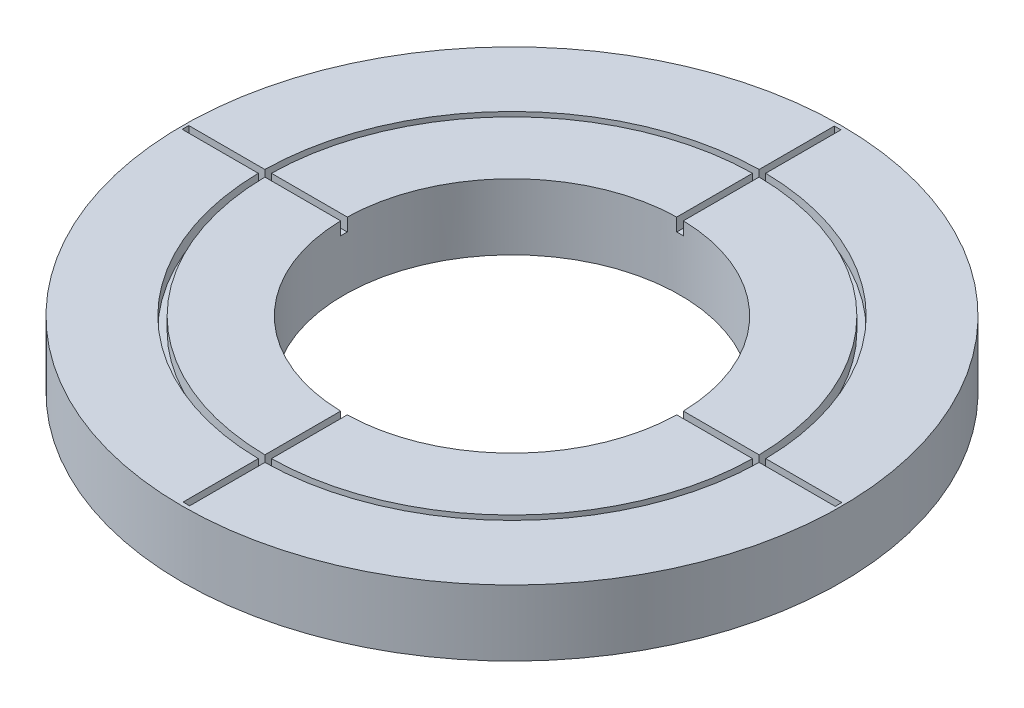
ISO-10303-21;
HEADER;
FILE_DESCRIPTION(('STEP AP214'),'2;1');
FILE_NAME('part.step','',(''),(''),'','','');
FILE_SCHEMA(('AUTOMOTIVE_DESIGN { 1 0 10303 214 1 1 1 1 }'));
ENDSEC;
DATA;
#1=APPLICATION_CONTEXT('core data for automotive mechanical design processes');
#2=APPLICATION_PROTOCOL_DEFINITION('international standard','automotive_design',2000,#1);
#3=PRODUCT_CONTEXT('',#1,'mechanical');
#4=PRODUCT('Part','Part','',(#3));
#5=PRODUCT_RELATED_PRODUCT_CATEGORY('part','',(#4));
#6=PRODUCT_DEFINITION_FORMATION('','',#4);
#7=PRODUCT_DEFINITION_CONTEXT('part definition',#1,'design');
#8=PRODUCT_DEFINITION('design','',#6,#7);
#9=PRODUCT_DEFINITION_SHAPE('','',#8);
#10=(LENGTH_UNIT() NAMED_UNIT(*) SI_UNIT(.MILLI.,.METRE.));
#11=(NAMED_UNIT(*) PLANE_ANGLE_UNIT() SI_UNIT($,.RADIAN.));
#12=(NAMED_UNIT(*) SI_UNIT($,.STERADIAN.) SOLID_ANGLE_UNIT());
#13=UNCERTAINTY_MEASURE_WITH_UNIT(LENGTH_MEASURE(1.E-05),#10,'distance_accuracy_value','');
#14=(GEOMETRIC_REPRESENTATION_CONTEXT(3) GLOBAL_UNCERTAINTY_ASSIGNED_CONTEXT((#13)) GLOBAL_UNIT_ASSIGNED_CONTEXT((#10,
#11,#12)) REPRESENTATION_CONTEXT('',''));
#15=CARTESIAN_POINT('',(0.,0.,0.));
#16=DIRECTION('',(0.,0.,1.));
#17=DIRECTION('',(1.,0.,0.));
#18=AXIS2_PLACEMENT_3D('',#15,#16,#17);
#19=CARTESIAN_POINT('',(0.,2.54,0.));
#20=DIRECTION('',(0.,1.,0.));
#21=DIRECTION('',(0.,0.,1.));
#22=AXIS2_PLACEMENT_3D('',#19,#20,#21);
#23=PLANE('',#22);
#24=DIRECTION('',(0.,0.,-1.));
#25=VECTOR('',#24,1.);
#26=CARTESIAN_POINT('',(0.127,2.54,12.5492328950801));
#27=LINE('',#26,#25);
#28=CARTESIAN_POINT('',(0.127,2.54,9.39714185271245));
#29=VERTEX_POINT('',#28);
#30=CARTESIAN_POINT('',(0.127,2.54,6.47575478226284));
#31=VERTEX_POINT('',#30);
#32=EDGE_CURVE('E273',#29,#31,#27,.T.);
#33=ORIENTED_EDGE('',*,*,#32,.F.);
#34=CARTESIAN_POINT('',(0.,2.54,0.));
#35=DIRECTION('',(0.,1.,0.));
#36=DIRECTION('',(0.,0.,1.));
#37=AXIS2_PLACEMENT_3D('',#34,#35,#36);
#38=CIRCLE('',#37,9.398);
#39=CARTESIAN_POINT('',(9.39714185271245,2.54,0.127));
#40=VERTEX_POINT('',#39);
#41=EDGE_CURVE('E470',#29,#40,#38,.T.);
#42=ORIENTED_EDGE('',*,*,#41,.T.);
#43=DIRECTION('',(1.,0.,0.));
#44=VECTOR('',#43,1.);
#45=CARTESIAN_POINT('',(-12.5827564064778,2.54,0.127));
#46=LINE('',#45,#44);
#47=CARTESIAN_POINT('',(6.47575478226284,2.54,0.127));
#48=VERTEX_POINT('',#47);
#49=EDGE_CURVE('E407',#48,#40,#46,.T.);
#50=ORIENTED_EDGE('',*,*,#49,.F.);
#51=CARTESIAN_POINT('',(0.,2.54,0.));
#52=DIRECTION('',(0.,1.,0.));
#53=DIRECTION('',(0.,0.,1.));
#54=AXIS2_PLACEMENT_3D('',#51,#52,#53);
#55=CIRCLE('',#54,6.477);
#56=EDGE_CURVE('E501',#31,#48,#55,.T.);
#57=ORIENTED_EDGE('',*,*,#56,.F.);
#58=EDGE_LOOP('',(#33,#42,#50,#57));
#59=FACE_BOUND('',#58,.T.);
#60=ADVANCED_FACE('F44',(#59),#23,.T.);
#61=CARTESIAN_POINT('',(0.,2.04,0.));
#62=DIRECTION('',(0.,1.,0.));
#63=DIRECTION('',(0.,0.,1.));
#64=AXIS2_PLACEMENT_3D('',#61,#62,#63);
#65=CYLINDRICAL_SURFACE('',#64,9.652);
#66=CARTESIAN_POINT('',(0.,2.04,0.));
#67=DIRECTION('',(0.,1.,0.));
#68=DIRECTION('',(0.,0.,1.));
#69=AXIS2_PLACEMENT_3D('',#66,#67,#68);
#70=CIRCLE('',#69,9.652);
#71=CARTESIAN_POINT('',(0.127,2.04,9.65116443751737));
#72=VERTEX_POINT('',#71);
#73=CARTESIAN_POINT('',(9.65116443751737,2.04,0.127));
#74=VERTEX_POINT('',#73);
#75=EDGE_CURVE('E488',#72,#74,#70,.T.);
#76=ORIENTED_EDGE('',*,*,#75,.F.);
#77=DIRECTION('',(0.,1.,0.));
#78=VECTOR('',#77,1.);
#79=CARTESIAN_POINT('',(0.127,2.04,9.65116443751737));
#80=LINE('',#79,#78);
#81=CARTESIAN_POINT('',(0.127,2.54,9.65116443751737));
#82=VERTEX_POINT('',#81);
#83=EDGE_CURVE('E276',#72,#82,#80,.T.);
#84=ORIENTED_EDGE('',*,*,#83,.T.);
#85=CARTESIAN_POINT('',(0.,2.54,0.));
#86=DIRECTION('',(0.,1.,0.));
#87=DIRECTION('',(0.,0.,1.));
#88=AXIS2_PLACEMENT_3D('',#85,#86,#87);
#89=CIRCLE('',#88,9.652);
#90=CARTESIAN_POINT('',(9.65116443751737,2.54,0.127));
#91=VERTEX_POINT('',#90);
#92=EDGE_CURVE('E495',#82,#91,#89,.T.);
#93=ORIENTED_EDGE('',*,*,#92,.T.);
#94=DIRECTION('',(0.,1.,0.));
#95=VECTOR('',#94,1.);
#96=CARTESIAN_POINT('',(9.65116443751737,2.04,0.127));
#97=LINE('',#96,#95);
#98=EDGE_CURVE('E458',#91,#74,#97,.F.);
#99=ORIENTED_EDGE('',*,*,#98,.T.);
#100=EDGE_LOOP('',(#76,#84,#93,#99));
#101=FACE_BOUND('',#100,.T.);
#102=ADVANCED_FACE('F628',(#101),#65,.F.);
#103=CARTESIAN_POINT('',(0.,2.04,0.));
#104=DIRECTION('',(0.,1.,0.));
#105=DIRECTION('',(0.,0.,1.));
#106=AXIS2_PLACEMENT_3D('',#103,#104,#105);
#107=CYLINDRICAL_SURFACE('',#106,9.398);
#108=DIRECTION('',(0.,1.,0.));
#109=VECTOR('',#108,1.);
#110=CARTESIAN_POINT('',(0.127,2.04,9.39714185271245));
#111=LINE('',#110,#109);
#112=CARTESIAN_POINT('',(0.127,2.04,9.39714185271245));
#113=VERTEX_POINT('',#112);
#114=EDGE_CURVE('E368',#113,#29,#111,.T.);
#115=ORIENTED_EDGE('',*,*,#114,.F.);
#116=CARTESIAN_POINT('',(0.,2.04,0.));
#117=DIRECTION('',(0.,1.,0.));
#118=DIRECTION('',(0.,0.,1.));
#119=AXIS2_PLACEMENT_3D('',#116,#117,#118);
#120=CIRCLE('',#119,9.398);
#121=CARTESIAN_POINT('',(9.39714185271245,2.04,0.127));
#122=VERTEX_POINT('',#121);
#123=EDGE_CURVE('E282',#113,#122,#120,.T.);
#124=ORIENTED_EDGE('',*,*,#123,.T.);
#125=DIRECTION('',(0.,1.,0.));
#126=VECTOR('',#125,1.);
#127=CARTESIAN_POINT('',(9.39714185271245,2.04,0.127));
#128=LINE('',#127,#126);
#129=EDGE_CURVE('E450',#40,#122,#128,.F.);
#130=ORIENTED_EDGE('',*,*,#129,.F.);
#131=ORIENTED_EDGE('',*,*,#41,.F.);
#132=EDGE_LOOP('',(#115,#124,#130,#131));
#133=FACE_BOUND('',#132,.T.);
#134=ADVANCED_FACE('F625',(#133),#107,.T.);
#135=CARTESIAN_POINT('',(0.127,2.54,-6.47575478226284));
#136=VERTEX_POINT('',#135);
#137=CARTESIAN_POINT('',(0.127,2.54,-9.39714185271245));
#138=VERTEX_POINT('',#137);
#139=EDGE_CURVE('E312',#136,#138,#27,.T.);
#140=ORIENTED_EDGE('',*,*,#139,.F.);
#141=CARTESIAN_POINT('',(6.47575478226284,2.54,-0.127));
#142=VERTEX_POINT('',#141);
#143=EDGE_CURVE('E502',#142,#136,#55,.T.);
#144=ORIENTED_EDGE('',*,*,#143,.F.);
#145=DIRECTION('',(-1.,0.,0.));
#146=VECTOR('',#145,1.);
#147=CARTESIAN_POINT('',(-12.5827564064778,2.54,-0.127));
#148=LINE('',#147,#146);
#149=CARTESIAN_POINT('',(9.39714185271245,2.54,-0.127));
#150=VERTEX_POINT('',#149);
#151=EDGE_CURVE('E403',#150,#142,#148,.T.);
#152=ORIENTED_EDGE('',*,*,#151,.F.);
#153=EDGE_CURVE('E482',#150,#138,#38,.T.);
#154=ORIENTED_EDGE('',*,*,#153,.T.);
#155=EDGE_LOOP('',(#140,#144,#152,#154));
#156=FACE_BOUND('',#155,.T.);
#157=ADVANCED_FACE('F627',(#156),#23,.T.);
#158=CARTESIAN_POINT('',(9.65116443751737,2.54,-0.127));
#159=VERTEX_POINT('',#158);
#160=CARTESIAN_POINT('',(0.127,2.54,-9.65116443751737));
#161=VERTEX_POINT('',#160);
#162=EDGE_CURVE('E496',#159,#161,#89,.T.);
#163=ORIENTED_EDGE('',*,*,#162,.T.);
#164=DIRECTION('',(0.,1.,0.));
#165=VECTOR('',#164,1.);
#166=CARTESIAN_POINT('',(0.127,2.04,-9.65116443751737));
#167=LINE('',#166,#165);
#168=CARTESIAN_POINT('',(0.127,2.04,-9.65116443751737));
#169=VERTEX_POINT('',#168);
#170=EDGE_CURVE('E360',#161,#169,#167,.F.);
#171=ORIENTED_EDGE('',*,*,#170,.T.);
#172=CARTESIAN_POINT('',(9.65116443751737,2.04,-0.127));
#173=VERTEX_POINT('',#172);
#174=EDGE_CURVE('E489',#173,#169,#70,.T.);
#175=ORIENTED_EDGE('',*,*,#174,.F.);
#176=DIRECTION('',(0.,1.,0.));
#177=VECTOR('',#176,1.);
#178=CARTESIAN_POINT('',(9.65116443751737,2.04,-0.127));
#179=LINE('',#178,#177);
#180=EDGE_CURVE('E432',#173,#159,#179,.T.);
#181=ORIENTED_EDGE('',*,*,#180,.T.);
#182=EDGE_LOOP('',(#163,#171,#175,#181));
#183=FACE_BOUND('',#182,.T.);
#184=ADVANCED_FACE('F580',(#183),#65,.F.);
#185=DIRECTION('',(0.,1.,0.));
#186=VECTOR('',#185,1.);
#187=CARTESIAN_POINT('',(0.127,2.04,-9.39714185271245));
#188=LINE('',#187,#186);
#189=CARTESIAN_POINT('',(0.127,2.04,-9.39714185271245));
#190=VERTEX_POINT('',#189);
#191=EDGE_CURVE('E357',#138,#190,#188,.F.);
#192=ORIENTED_EDGE('',*,*,#191,.F.);
#193=ORIENTED_EDGE('',*,*,#153,.F.);
#194=DIRECTION('',(0.,1.,0.));
#195=VECTOR('',#194,1.);
#196=CARTESIAN_POINT('',(9.39714185271245,2.04,-0.127));
#197=LINE('',#196,#195);
#198=CARTESIAN_POINT('',(9.39714185271245,2.04,-0.127));
#199=VERTEX_POINT('',#198);
#200=EDGE_CURVE('E415',#199,#150,#197,.T.);
#201=ORIENTED_EDGE('',*,*,#200,.F.);
#202=EDGE_CURVE('E476',#199,#190,#120,.T.);
#203=ORIENTED_EDGE('',*,*,#202,.T.);
#204=EDGE_LOOP('',(#192,#193,#201,#203));
#205=FACE_BOUND('',#204,.T.);
#206=ADVANCED_FACE('F630',(#205),#107,.T.);
#207=DIRECTION('',(0.,0.,1.));
#208=VECTOR('',#207,1.);
#209=CARTESIAN_POINT('',(-0.127,2.54,12.5492328950801));
#210=LINE('',#209,#208);
#211=CARTESIAN_POINT('',(-0.127,2.54,6.47575478226284));
#212=VERTEX_POINT('',#211);
#213=CARTESIAN_POINT('',(-0.127,2.54,9.39714185271245));
#214=VERTEX_POINT('',#213);
#215=EDGE_CURVE('E316',#212,#214,#210,.T.);
#216=ORIENTED_EDGE('',*,*,#215,.F.);
#217=CARTESIAN_POINT('',(-6.47575478226284,2.54,0.127));
#218=VERTEX_POINT('',#217);
#219=EDGE_CURVE('E497',#218,#212,#55,.T.);
#220=ORIENTED_EDGE('',*,*,#219,.F.);
#221=CARTESIAN_POINT('',(-9.39714185271245,2.54,0.127));
#222=VERTEX_POINT('',#221);
#223=EDGE_CURVE('E410',#222,#218,#46,.T.);
#224=ORIENTED_EDGE('',*,*,#223,.F.);
#225=EDGE_CURVE('E477',#222,#214,#38,.T.);
#226=ORIENTED_EDGE('',*,*,#225,.T.);
#227=EDGE_LOOP('',(#216,#220,#224,#226));
#228=FACE_BOUND('',#227,.T.);
#229=ADVANCED_FACE('F637',(#228),#23,.T.);
#230=CARTESIAN_POINT('',(-9.65116443751737,2.54,0.127));
#231=VERTEX_POINT('',#230);
#232=CARTESIAN_POINT('',(-0.127,2.54,9.65116443751737));
#233=VERTEX_POINT('',#232);
#234=EDGE_CURVE('E490',#231,#233,#89,.T.);
#235=ORIENTED_EDGE('',*,*,#234,.T.);
#236=DIRECTION('',(0.,1.,0.));
#237=VECTOR('',#236,1.);
#238=CARTESIAN_POINT('',(-0.127,2.04,9.65116443751737));
#239=LINE('',#238,#237);
#240=CARTESIAN_POINT('',(-0.127,2.04,9.65116443751737));
#241=VERTEX_POINT('',#240);
#242=EDGE_CURVE('E351',#233,#241,#239,.F.);
#243=ORIENTED_EDGE('',*,*,#242,.T.);
#244=CARTESIAN_POINT('',(-9.65116443751737,2.04,0.127));
#245=VERTEX_POINT('',#244);
#246=EDGE_CURVE('E483',#245,#241,#70,.T.);
#247=ORIENTED_EDGE('',*,*,#246,.F.);
#248=DIRECTION('',(0.,1.,0.));
#249=VECTOR('',#248,1.);
#250=CARTESIAN_POINT('',(-9.65116443751737,2.04,0.127));
#251=LINE('',#250,#249);
#252=EDGE_CURVE('E454',#245,#231,#251,.T.);
#253=ORIENTED_EDGE('',*,*,#252,.T.);
#254=EDGE_LOOP('',(#235,#243,#247,#253));
#255=FACE_BOUND('',#254,.T.);
#256=ADVANCED_FACE('F669',(#255),#65,.F.);
#257=DIRECTION('',(0.,1.,0.));
#258=VECTOR('',#257,1.);
#259=CARTESIAN_POINT('',(-0.127,2.04,9.39714185271245));
#260=LINE('',#259,#258);
#261=CARTESIAN_POINT('',(-0.127,2.04,9.39714185271245));
#262=VERTEX_POINT('',#261);
#263=EDGE_CURVE('E348',#214,#262,#260,.F.);
#264=ORIENTED_EDGE('',*,*,#263,.F.);
#265=ORIENTED_EDGE('',*,*,#225,.F.);
#266=DIRECTION('',(0.,1.,0.));
#267=VECTOR('',#266,1.);
#268=CARTESIAN_POINT('',(-9.39714185271245,2.04,0.127));
#269=LINE('',#268,#267);
#270=CARTESIAN_POINT('',(-9.39714185271245,2.04,0.127));
#271=VERTEX_POINT('',#270);
#272=EDGE_CURVE('E447',#271,#222,#269,.T.);
#273=ORIENTED_EDGE('',*,*,#272,.F.);
#274=EDGE_CURVE('E471',#271,#262,#120,.T.);
#275=ORIENTED_EDGE('',*,*,#274,.T.);
#276=EDGE_LOOP('',(#264,#265,#273,#275));
#277=FACE_BOUND('',#276,.T.);
#278=ADVANCED_FACE('F642',(#277),#107,.T.);
#279=CARTESIAN_POINT('',(-0.127,2.54,-9.39714185271245));
#280=VERTEX_POINT('',#279);
#281=CARTESIAN_POINT('',(-0.127,2.54,-6.47575478226284));
#282=VERTEX_POINT('',#281);
#283=EDGE_CURVE('E321',#280,#282,#210,.T.);
#284=ORIENTED_EDGE('',*,*,#283,.F.);
#285=CARTESIAN_POINT('',(-9.39714185271245,2.54,-0.127));
#286=VERTEX_POINT('',#285);
#287=EDGE_CURVE('E481',#280,#286,#38,.T.);
#288=ORIENTED_EDGE('',*,*,#287,.T.);
#289=CARTESIAN_POINT('',(-6.47575478226284,2.54,-0.127));
#290=VERTEX_POINT('',#289);
#291=EDGE_CURVE('E398',#290,#286,#148,.T.);
#292=ORIENTED_EDGE('',*,*,#291,.F.);
#293=EDGE_CURVE('E500',#282,#290,#55,.T.);
#294=ORIENTED_EDGE('',*,*,#293,.F.);
#295=EDGE_LOOP('',(#284,#288,#292,#294));
#296=FACE_BOUND('',#295,.T.);
#297=ADVANCED_FACE('F652',(#296),#23,.T.);
#298=CARTESIAN_POINT('',(0.,2.04,0.));
#299=DIRECTION('',(0.,1.,0.));
#300=DIRECTION('',(0.,0.,1.));
#301=AXIS2_PLACEMENT_3D('',#298,#299,#300);
#302=CYLINDRICAL_SURFACE('',#301,6.477);
#303=DIRECTION('',(0.,1.,0.));
#304=VECTOR('',#303,1.);
#305=CARTESIAN_POINT('',(-6.47575478226284,2.04,-0.127));
#306=LINE('',#305,#304);
#307=CARTESIAN_POINT('',(-6.47575478226284,2.04,-0.127));
#308=VERTEX_POINT('',#307);
#309=EDGE_CURVE('E444',#290,#308,#306,.F.);
#310=ORIENTED_EDGE('',*,*,#309,.T.);
#311=CARTESIAN_POINT('',(0.,2.04,0.));
#312=DIRECTION('',(0.,1.,0.));
#313=DIRECTION('',(0.,0.,1.));
#314=AXIS2_PLACEMENT_3D('',#311,#312,#313);
#315=CIRCLE('',#314,6.477);
#316=CARTESIAN_POINT('',(-6.47575478226284,2.04,0.127));
#317=VERTEX_POINT('',#316);
#318=EDGE_CURVE('E265',#308,#317,#315,.T.);
#319=ORIENTED_EDGE('',*,*,#318,.T.);
#320=DIRECTION('',(0.,1.,0.));
#321=VECTOR('',#320,1.);
#322=CARTESIAN_POINT('',(-6.47575478226284,2.04,0.127));
#323=LINE('',#322,#321);
#324=EDGE_CURVE('E462',#317,#218,#323,.T.);
#325=ORIENTED_EDGE('',*,*,#324,.T.);
#326=ORIENTED_EDGE('',*,*,#219,.T.);
#327=DIRECTION('',(0.,1.,0.));
#328=VECTOR('',#327,1.);
#329=CARTESIAN_POINT('',(-0.127,2.04,6.47575478226284));
#330=LINE('',#329,#328);
#331=CARTESIAN_POINT('',(-0.127,2.04,6.47575478226284));
#332=VERTEX_POINT('',#331);
#333=EDGE_CURVE('E262',#212,#332,#330,.F.);
#334=ORIENTED_EDGE('',*,*,#333,.T.);
#335=CARTESIAN_POINT('',(0.127,2.04,6.47575478226284));
#336=VERTEX_POINT('',#335);
#337=EDGE_CURVE('E254',#332,#336,#315,.T.);
#338=ORIENTED_EDGE('',*,*,#337,.T.);
#339=DIRECTION('',(0.,1.,0.));
#340=VECTOR('',#339,1.);
#341=CARTESIAN_POINT('',(0.127,2.04,6.47575478226284));
#342=LINE('',#341,#340);
#343=EDGE_CURVE('E259',#336,#31,#342,.T.);
#344=ORIENTED_EDGE('',*,*,#343,.T.);
#345=ORIENTED_EDGE('',*,*,#56,.T.);
#346=DIRECTION('',(0.,1.,0.));
#347=VECTOR('',#346,1.);
#348=CARTESIAN_POINT('',(6.47575478226284,2.04,0.127));
#349=LINE('',#348,#347);
#350=CARTESIAN_POINT('',(6.47575478226284,2.04,0.127));
#351=VERTEX_POINT('',#350);
#352=EDGE_CURVE('E466',#48,#351,#349,.F.);
#353=ORIENTED_EDGE('',*,*,#352,.T.);
#354=CARTESIAN_POINT('',(6.47575478226284,2.04,-0.127));
#355=VERTEX_POINT('',#354);
#356=EDGE_CURVE('E267',#351,#355,#315,.T.);
#357=ORIENTED_EDGE('',*,*,#356,.T.);
#358=DIRECTION('',(0.,1.,0.));
#359=VECTOR('',#358,1.);
#360=CARTESIAN_POINT('',(6.47575478226284,2.04,-0.127));
#361=LINE('',#360,#359);
#362=EDGE_CURVE('E440',#355,#142,#361,.T.);
#363=ORIENTED_EDGE('',*,*,#362,.T.);
#364=ORIENTED_EDGE('',*,*,#143,.T.);
#365=DIRECTION('',(0.,1.,0.));
#366=VECTOR('',#365,1.);
#367=CARTESIAN_POINT('',(0.127,2.04,-6.47575478226284));
#368=LINE('',#367,#366);
#369=CARTESIAN_POINT('',(0.127,2.04,-6.47575478226284));
#370=VERTEX_POINT('',#369);
#371=EDGE_CURVE('E364',#136,#370,#368,.F.);
#372=ORIENTED_EDGE('',*,*,#371,.T.);
#373=CARTESIAN_POINT('',(-0.127,2.04,-6.47575478226284));
#374=VERTEX_POINT('',#373);
#375=EDGE_CURVE('E551',#370,#374,#315,.T.);
#376=ORIENTED_EDGE('',*,*,#375,.T.);
#377=DIRECTION('',(0.,1.,0.));
#378=VECTOR('',#377,1.);
#379=CARTESIAN_POINT('',(-0.127,2.04,-6.47575478226284));
#380=LINE('',#379,#378);
#381=EDGE_CURVE('E344',#374,#282,#380,.T.);
#382=ORIENTED_EDGE('',*,*,#381,.T.);
#383=ORIENTED_EDGE('',*,*,#293,.T.);
#384=EDGE_LOOP('',(#310,#319,#325,#326,#334,#338,#344,#345,#353,#357,#363,#364,#372,#376,#382,#383));
#385=FACE_BOUND('',#384,.T.);
#386=CARTESIAN_POINT('',(0.,0.,0.));
#387=DIRECTION('',(0.,1.,0.));
#388=DIRECTION('',(0.,0.,1.));
#389=AXIS2_PLACEMENT_3D('',#386,#387,#388);
#390=CIRCLE('',#389,6.477);
#391=CARTESIAN_POINT('',(0.,0.,6.477));
#392=VERTEX_POINT('',#391);
#393=EDGE_CURVE('E293',#392,#392,#390,.T.);
#394=ORIENTED_EDGE('',*,*,#393,.F.);
#395=EDGE_LOOP('',(#394));
#396=FACE_BOUND('',#395,.T.);
#397=ADVANCED_FACE('F257',(#385,#396),#302,.F.);
#398=CARTESIAN_POINT('',(0.,2.04,0.));
#399=DIRECTION('',(0.,1.,0.));
#400=DIRECTION('',(0.,0.,1.));
#401=AXIS2_PLACEMENT_3D('',#398,#399,#400);
#402=PLANE('',#401);
#403=ORIENTED_EDGE('',*,*,#356,.F.);
#404=DIRECTION('',(1.,0.,0.));
#405=VECTOR('',#404,1.);
#406=CARTESIAN_POINT('',(-12.5827564064778,2.04,0.127));
#407=LINE('',#406,#405);
#408=EDGE_CURVE('E564',#351,#122,#407,.T.);
#409=ORIENTED_EDGE('',*,*,#408,.T.);
#410=ORIENTED_EDGE('',*,*,#123,.F.);
#411=DIRECTION('',(0.,0.,-1.));
#412=VECTOR('',#411,1.);
#413=CARTESIAN_POINT('',(0.127,2.04,12.5492328950801));
#414=LINE('',#413,#412);
#415=EDGE_CURVE('E270',#113,#336,#414,.T.);
#416=ORIENTED_EDGE('',*,*,#415,.T.);
#417=ORIENTED_EDGE('',*,*,#337,.F.);
#418=DIRECTION('',(0.,0.,1.));
#419=VECTOR('',#418,1.);
#420=CARTESIAN_POINT('',(-0.127,2.04,12.5492328950801));
#421=LINE('',#420,#419);
#422=EDGE_CURVE('E60',#332,#262,#421,.T.);
#423=ORIENTED_EDGE('',*,*,#422,.T.);
#424=ORIENTED_EDGE('',*,*,#274,.F.);
#425=EDGE_CURVE('E395',#271,#317,#407,.T.);
#426=ORIENTED_EDGE('',*,*,#425,.T.);
#427=ORIENTED_EDGE('',*,*,#318,.F.);
#428=DIRECTION('',(-1.,0.,0.));
#429=VECTOR('',#428,1.);
#430=CARTESIAN_POINT('',(-12.5827564064778,2.04,-0.127));
#431=LINE('',#430,#429);
#432=CARTESIAN_POINT('',(-9.39714185271245,2.04,-0.127));
#433=VERTEX_POINT('',#432);
#434=EDGE_CURVE('E981',#308,#433,#431,.T.);
#435=ORIENTED_EDGE('',*,*,#434,.T.);
#436=CARTESIAN_POINT('',(-0.127,2.04,-9.39714185271245));
#437=VERTEX_POINT('',#436);
#438=EDGE_CURVE('E475',#437,#433,#120,.T.);
#439=ORIENTED_EDGE('',*,*,#438,.F.);
#440=EDGE_CURVE('E303',#437,#374,#421,.T.);
#441=ORIENTED_EDGE('',*,*,#440,.T.);
#442=ORIENTED_EDGE('',*,*,#375,.F.);
#443=EDGE_CURVE('E67',#370,#190,#414,.T.);
#444=ORIENTED_EDGE('',*,*,#443,.T.);
#445=ORIENTED_EDGE('',*,*,#202,.F.);
#446=EDGE_CURVE('E385',#199,#355,#431,.T.);
#447=ORIENTED_EDGE('',*,*,#446,.T.);
#448=EDGE_LOOP('',(#403,#409,#410,#416,#417,#423,#424,#426,#427,#435,#439,#441,#442,#444,#445,#447));
#449=FACE_BOUND('',#448,.T.);
#450=ORIENTED_EDGE('',*,*,#246,.T.);
#451=CARTESIAN_POINT('',(-0.127,2.04,12.5492328950801));
#452=VERTEX_POINT('',#451);
#453=EDGE_CURVE('E297',#241,#452,#421,.T.);
#454=ORIENTED_EDGE('',*,*,#453,.T.);
#455=DIRECTION('',(1.,0.,0.));
#456=VECTOR('',#455,1.);
#457=CARTESIAN_POINT('',(-0.127,2.04,12.5492328950801));
#458=LINE('',#457,#456);
#459=CARTESIAN_POINT('',(0.127,2.04,12.5492328950801));
#460=VERTEX_POINT('',#459);
#461=EDGE_CURVE('E302',#452,#460,#458,.T.);
#462=ORIENTED_EDGE('',*,*,#461,.T.);
#463=EDGE_CURVE('E284',#460,#72,#414,.T.);
#464=ORIENTED_EDGE('',*,*,#463,.T.);
#465=ORIENTED_EDGE('',*,*,#75,.T.);
#466=CARTESIAN_POINT('',(12.5827564064778,2.04,0.127));
#467=VERTEX_POINT('',#466);
#468=EDGE_CURVE('E389',#74,#467,#407,.T.);
#469=ORIENTED_EDGE('',*,*,#468,.T.);
#470=DIRECTION('',(0.,0.,-1.));
#471=VECTOR('',#470,1.);
#472=CARTESIAN_POINT('',(12.5827564064778,2.04,0.127));
#473=LINE('',#472,#471);
#474=CARTESIAN_POINT('',(12.5827564064778,2.04,-0.127));
#475=VERTEX_POINT('',#474);
#476=EDGE_CURVE('E374',#467,#475,#473,.T.);
#477=ORIENTED_EDGE('',*,*,#476,.T.);
#478=EDGE_CURVE('E380',#475,#173,#431,.T.);
#479=ORIENTED_EDGE('',*,*,#478,.T.);
#480=ORIENTED_EDGE('',*,*,#174,.T.);
#481=CARTESIAN_POINT('',(0.127,2.04,-12.5492328950801));
#482=VERTEX_POINT('',#481);
#483=EDGE_CURVE('E290',#169,#482,#414,.T.);
#484=ORIENTED_EDGE('',*,*,#483,.T.);
#485=DIRECTION('',(-1.,0.,0.));
#486=VECTOR('',#485,1.);
#487=CARTESIAN_POINT('',(-0.127,2.04,-12.5492328950801));
#488=LINE('',#487,#486);
#489=CARTESIAN_POINT('',(-0.127,2.04,-12.5492328950801));
#490=VERTEX_POINT('',#489);
#491=EDGE_CURVE('E289',#482,#490,#488,.T.);
#492=ORIENTED_EDGE('',*,*,#491,.T.);
#493=CARTESIAN_POINT('',(-0.127,2.04,-9.65116443751737));
#494=VERTEX_POINT('',#493);
#495=EDGE_CURVE('E298',#490,#494,#421,.T.);
#496=ORIENTED_EDGE('',*,*,#495,.T.);
#497=CARTESIAN_POINT('',(-9.65116443751737,2.04,-0.127));
#498=VERTEX_POINT('',#497);
#499=EDGE_CURVE('E487',#494,#498,#70,.T.);
#500=ORIENTED_EDGE('',*,*,#499,.T.);
#501=CARTESIAN_POINT('',(-12.5827564064778,2.04,-0.127));
#502=VERTEX_POINT('',#501);
#503=EDGE_CURVE('E378',#498,#502,#431,.T.);
#504=ORIENTED_EDGE('',*,*,#503,.T.);
#505=DIRECTION('',(0.,0.,1.));
#506=VECTOR('',#505,1.);
#507=CARTESIAN_POINT('',(-12.5827564064778,2.04,0.127));
#508=LINE('',#507,#506);
#509=CARTESIAN_POINT('',(-12.5827564064778,2.04,0.127));
#510=VERTEX_POINT('',#509);
#511=EDGE_CURVE('E384',#502,#510,#508,.T.);
#512=ORIENTED_EDGE('',*,*,#511,.T.);
#513=EDGE_CURVE('E390',#510,#245,#407,.T.);
#514=ORIENTED_EDGE('',*,*,#513,.T.);
#515=EDGE_LOOP('',(#450,#454,#462,#464,#465,#469,#477,#479,#480,#484,#492,#496,#500,#504,#512,#514));
#516=FACE_BOUND('',#515,.T.);
#517=ADVANCED_FACE('F279',(#449,#516),#402,.T.);
#518=ORIENTED_EDGE('',*,*,#499,.F.);
#519=DIRECTION('',(0.,1.,0.));
#520=VECTOR('',#519,1.);
#521=CARTESIAN_POINT('',(-0.127,2.04,-9.65116443751737));
#522=LINE('',#521,#520);
#523=CARTESIAN_POINT('',(-0.127,2.54,-9.65116443751737));
#524=VERTEX_POINT('',#523);
#525=EDGE_CURVE('E340',#494,#524,#522,.T.);
#526=ORIENTED_EDGE('',*,*,#525,.T.);
#527=CARTESIAN_POINT('',(-9.65116443751737,2.54,-0.127));
#528=VERTEX_POINT('',#527);
#529=EDGE_CURVE('E494',#524,#528,#89,.T.);
#530=ORIENTED_EDGE('',*,*,#529,.T.);
#531=DIRECTION('',(0.,1.,0.));
#532=VECTOR('',#531,1.);
#533=CARTESIAN_POINT('',(-9.65116443751737,2.04,-0.127));
#534=LINE('',#533,#532);
#535=EDGE_CURVE('E436',#528,#498,#534,.F.);
#536=ORIENTED_EDGE('',*,*,#535,.T.);
#537=EDGE_LOOP('',(#518,#526,#530,#536));
#538=FACE_BOUND('',#537,.T.);
#539=ADVANCED_FACE('F639',(#538),#65,.F.);
#540=DIRECTION('',(0.,1.,0.));
#541=VECTOR('',#540,1.);
#542=CARTESIAN_POINT('',(-0.127,2.04,-9.39714185271245));
#543=LINE('',#542,#541);
#544=EDGE_CURVE('E328',#437,#280,#543,.T.);
#545=ORIENTED_EDGE('',*,*,#544,.F.);
#546=ORIENTED_EDGE('',*,*,#438,.T.);
#547=DIRECTION('',(0.,1.,0.));
#548=VECTOR('',#547,1.);
#549=CARTESIAN_POINT('',(-9.39714185271245,2.04,-0.127));
#550=LINE('',#549,#548);
#551=EDGE_CURVE('E428',#286,#433,#550,.F.);
#552=ORIENTED_EDGE('',*,*,#551,.F.);
#553=ORIENTED_EDGE('',*,*,#287,.F.);
#554=EDGE_LOOP('',(#545,#546,#552,#553));
#555=FACE_BOUND('',#554,.T.);
#556=ADVANCED_FACE('F631',(#555),#107,.T.);
#557=CARTESIAN_POINT('',(0.,0.,0.));
#558=DIRECTION('',(0.,1.,0.));
#559=DIRECTION('',(0.,0.,1.));
#560=AXIS2_PLACEMENT_3D('',#557,#558,#559);
#561=PLANE('',#560);
#562=ORIENTED_EDGE('',*,*,#393,.T.);
#563=EDGE_LOOP('',(#562));
#564=FACE_BOUND('',#563,.T.);
#565=CARTESIAN_POINT('',(0.,0.,0.));
#566=DIRECTION('',(0.,1.,0.));
#567=DIRECTION('',(0.,0.,1.));
#568=AXIS2_PLACEMENT_3D('',#565,#566,#567);
#569=CIRCLE('',#568,12.7);
#570=CARTESIAN_POINT('',(0.,0.,12.7));
#571=VERTEX_POINT('',#570);
#572=EDGE_CURVE('E508',#571,#571,#569,.T.);
#573=ORIENTED_EDGE('',*,*,#572,.F.);
#574=EDGE_LOOP('',(#573));
#575=FACE_BOUND('',#574,.T.);
#576=ADVANCED_FACE('F644',(#564,#575),#561,.F.);
#577=CARTESIAN_POINT('',(0.,2.54,0.));
#578=DIRECTION('',(0.,-1.,0.));
#579=DIRECTION('',(0.,0.,-1.));
#580=AXIS2_PLACEMENT_3D('',#577,#578,#579);
#581=CYLINDRICAL_SURFACE('',#580,12.7);
#582=CARTESIAN_POINT('',(0.,2.54,0.));
#583=DIRECTION('',(0.,1.,0.));
#584=DIRECTION('',(0.,0.,1.));
#585=AXIS2_PLACEMENT_3D('',#582,#583,#584);
#586=CIRCLE('',#585,12.7);
#587=CARTESIAN_POINT('',(0.,2.54,12.7));
#588=VERTEX_POINT('',#587);
#589=EDGE_CURVE('E503',#588,#588,#586,.T.);
#590=ORIENTED_EDGE('',*,*,#589,.F.);
#591=EDGE_LOOP('',(#590));
#592=FACE_BOUND('',#591,.T.);
#593=ORIENTED_EDGE('',*,*,#572,.T.);
#594=EDGE_LOOP('',(#593));
#595=FACE_BOUND('',#594,.T.);
#596=ADVANCED_FACE('F46',(#592,#595),#581,.T.);
#597=CARTESIAN_POINT('',(0.127,2.54,12.5492328950801));
#598=VERTEX_POINT('',#597);
#599=EDGE_CURVE('E308',#598,#82,#27,.T.);
#600=ORIENTED_EDGE('',*,*,#599,.F.);
#601=DIRECTION('',(1.,0.,0.));
#602=VECTOR('',#601,1.);
#603=CARTESIAN_POINT('',(-0.127,2.54,12.5492328950801));
#604=LINE('',#603,#602);
#605=CARTESIAN_POINT('',(-0.127,2.54,12.5492328950801));
#606=VERTEX_POINT('',#605);
#607=EDGE_CURVE('E320',#606,#598,#604,.T.);
#608=ORIENTED_EDGE('',*,*,#607,.F.);
#609=DIRECTION('',(0.,0.,1.));
#610=VECTOR('',#609,1.);
#611=CARTESIAN_POINT('',(-0.127,2.54,0.));
#612=LINE('',#611,#610);
#613=EDGE_CURVE('E11',#233,#606,#612,.T.);
#614=ORIENTED_EDGE('',*,*,#613,.F.);
#615=ORIENTED_EDGE('',*,*,#234,.F.);
#616=CARTESIAN_POINT('',(-12.5827564064778,2.54,0.127));
#617=VERTEX_POINT('',#616);
#618=EDGE_CURVE('E379',#617,#231,#46,.T.);
#619=ORIENTED_EDGE('',*,*,#618,.F.);
#620=DIRECTION('',(0.,0.,1.));
#621=VECTOR('',#620,1.);
#622=CARTESIAN_POINT('',(-12.5827564064778,2.54,0.127));
#623=LINE('',#622,#621);
#624=CARTESIAN_POINT('',(-12.5827564064778,2.54,-0.127));
#625=VERTEX_POINT('',#624);
#626=EDGE_CURVE('E402',#625,#617,#623,.T.);
#627=ORIENTED_EDGE('',*,*,#626,.F.);
#628=DIRECTION('',(-1.,0.,0.));
#629=VECTOR('',#628,1.);
#630=CARTESIAN_POINT('',(0.,2.54,-0.127));
#631=LINE('',#630,#629);
#632=EDGE_CURVE('E507',#528,#625,#631,.T.);
#633=ORIENTED_EDGE('',*,*,#632,.F.);
#634=ORIENTED_EDGE('',*,*,#529,.F.);
#635=CARTESIAN_POINT('',(-0.127,2.54,-12.5492328950801));
#636=VERTEX_POINT('',#635);
#637=EDGE_CURVE('E317',#636,#524,#210,.T.);
#638=ORIENTED_EDGE('',*,*,#637,.F.);
#639=DIRECTION('',(-1.,0.,0.));
#640=VECTOR('',#639,1.);
#641=CARTESIAN_POINT('',(-0.127,2.54,-12.5492328950801));
#642=LINE('',#641,#640);
#643=CARTESIAN_POINT('',(0.127,2.54,-12.5492328950801));
#644=VERTEX_POINT('',#643);
#645=EDGE_CURVE('E311',#644,#636,#642,.T.);
#646=ORIENTED_EDGE('',*,*,#645,.F.);
#647=DIRECTION('',(0.,0.,-1.));
#648=VECTOR('',#647,1.);
#649=CARTESIAN_POINT('',(0.127,2.54,0.));
#650=LINE('',#649,#648);
#651=EDGE_CURVE('E48',#161,#644,#650,.T.);
#652=ORIENTED_EDGE('',*,*,#651,.F.);
#653=ORIENTED_EDGE('',*,*,#162,.F.);
#654=CARTESIAN_POINT('',(12.5827564064778,2.54,-0.127));
#655=VERTEX_POINT('',#654);
#656=EDGE_CURVE('E399',#655,#159,#148,.T.);
#657=ORIENTED_EDGE('',*,*,#656,.F.);
#658=DIRECTION('',(0.,0.,-1.));
#659=VECTOR('',#658,1.);
#660=CARTESIAN_POINT('',(12.5827564064778,2.54,0.127));
#661=LINE('',#660,#659);
#662=CARTESIAN_POINT('',(12.5827564064778,2.54,0.127));
#663=VERTEX_POINT('',#662);
#664=EDGE_CURVE('E275',#663,#655,#661,.T.);
#665=ORIENTED_EDGE('',*,*,#664,.F.);
#666=DIRECTION('',(1.,0.,0.));
#667=VECTOR('',#666,1.);
#668=CARTESIAN_POINT('',(0.,2.54,0.127));
#669=LINE('',#668,#667);
#670=EDGE_CURVE('E514',#91,#663,#669,.T.);
#671=ORIENTED_EDGE('',*,*,#670,.F.);
#672=ORIENTED_EDGE('',*,*,#92,.F.);
#673=EDGE_LOOP('',(#600,#608,#614,#615,#619,#627,#633,#634,#638,#646,#652,#653,#657,#665,#671,#672));
#674=FACE_BOUND('',#673,.T.);
#675=ORIENTED_EDGE('',*,*,#589,.T.);
#676=EDGE_LOOP('',(#675));
#677=FACE_BOUND('',#676,.T.);
#678=ADVANCED_FACE('F533',(#674,#677),#23,.T.);
#679=CARTESIAN_POINT('',(-12.5827564064778,2.04,-0.127));
#680=DIRECTION('',(0.,0.,-1.));
#681=DIRECTION('',(-1.,0.,0.));
#682=AXIS2_PLACEMENT_3D('',#679,#680,#681);
#683=PLANE('',#682);
#684=ORIENTED_EDGE('',*,*,#632,.T.);
#685=DIRECTION('',(0.,1.,0.));
#686=VECTOR('',#685,1.);
#687=CARTESIAN_POINT('',(-12.5827564064778,2.04,-0.127));
#688=LINE('',#687,#686);
#689=EDGE_CURVE('E419',#502,#625,#688,.T.);
#690=ORIENTED_EDGE('',*,*,#689,.F.);
#691=ORIENTED_EDGE('',*,*,#503,.F.);
#692=ORIENTED_EDGE('',*,*,#535,.F.);
#693=EDGE_LOOP('',(#684,#690,#691,#692));
#694=FACE_BOUND('',#693,.T.);
#695=ADVANCED_FACE('F651',(#694),#683,.F.);
#696=CARTESIAN_POINT('',(-12.5827564064778,2.04,0.127));
#697=DIRECTION('',(-1.,0.,0.));
#698=DIRECTION('',(0.,0.,1.));
#699=AXIS2_PLACEMENT_3D('',#696,#697,#698);
#700=PLANE('',#699);
#701=ORIENTED_EDGE('',*,*,#626,.T.);
#702=DIRECTION('',(0.,1.,0.));
#703=VECTOR('',#702,1.);
#704=CARTESIAN_POINT('',(-12.5827564064778,2.04,0.127));
#705=LINE('',#704,#703);
#706=EDGE_CURVE('E416',#510,#617,#705,.T.);
#707=ORIENTED_EDGE('',*,*,#706,.F.);
#708=ORIENTED_EDGE('',*,*,#511,.F.);
#709=ORIENTED_EDGE('',*,*,#689,.T.);
#710=EDGE_LOOP('',(#701,#707,#708,#709));
#711=FACE_BOUND('',#710,.T.);
#712=ADVANCED_FACE('F657',(#711),#700,.F.);
#713=CARTESIAN_POINT('',(-12.5827564064778,2.04,0.127));
#714=DIRECTION('',(0.,0.,1.));
#715=DIRECTION('',(1.,0.,0.));
#716=AXIS2_PLACEMENT_3D('',#713,#714,#715);
#717=PLANE('',#716);
#718=ORIENTED_EDGE('',*,*,#513,.F.);
#719=ORIENTED_EDGE('',*,*,#706,.T.);
#720=ORIENTED_EDGE('',*,*,#618,.T.);
#721=ORIENTED_EDGE('',*,*,#252,.F.);
#722=EDGE_LOOP('',(#718,#719,#720,#721));
#723=FACE_BOUND('',#722,.T.);
#724=ADVANCED_FACE('F705',(#723),#717,.F.);
#725=ORIENTED_EDGE('',*,*,#478,.F.);
#726=DIRECTION('',(0.,1.,0.));
#727=VECTOR('',#726,1.);
#728=CARTESIAN_POINT('',(12.5827564064778,2.04,-0.127));
#729=LINE('',#728,#727);
#730=EDGE_CURVE('E394',#475,#655,#729,.T.);
#731=ORIENTED_EDGE('',*,*,#730,.T.);
#732=ORIENTED_EDGE('',*,*,#656,.T.);
#733=ORIENTED_EDGE('',*,*,#180,.F.);
#734=EDGE_LOOP('',(#725,#731,#732,#733));
#735=FACE_BOUND('',#734,.T.);
#736=ADVANCED_FACE('F578',(#735),#683,.F.);
#737=ORIENTED_EDGE('',*,*,#670,.T.);
#738=DIRECTION('',(0.,1.,0.));
#739=VECTOR('',#738,1.);
#740=CARTESIAN_POINT('',(12.5827564064778,2.04,0.127));
#741=LINE('',#740,#739);
#742=EDGE_CURVE('E411',#467,#663,#741,.T.);
#743=ORIENTED_EDGE('',*,*,#742,.F.);
#744=ORIENTED_EDGE('',*,*,#468,.F.);
#745=ORIENTED_EDGE('',*,*,#98,.F.);
#746=EDGE_LOOP('',(#737,#743,#744,#745));
#747=FACE_BOUND('',#746,.T.);
#748=ADVANCED_FACE('F571',(#747),#717,.F.);
#749=CARTESIAN_POINT('',(12.5827564064778,2.04,0.127));
#750=DIRECTION('',(1.,0.,0.));
#751=DIRECTION('',(0.,0.,-1.));
#752=AXIS2_PLACEMENT_3D('',#749,#750,#751);
#753=PLANE('',#752);
#754=ORIENTED_EDGE('',*,*,#664,.T.);
#755=ORIENTED_EDGE('',*,*,#730,.F.);
#756=ORIENTED_EDGE('',*,*,#476,.F.);
#757=ORIENTED_EDGE('',*,*,#742,.T.);
#758=EDGE_LOOP('',(#754,#755,#756,#757));
#759=FACE_BOUND('',#758,.T.);
#760=ADVANCED_FACE('F574',(#759),#753,.F.);
#761=ORIENTED_EDGE('',*,*,#446,.F.);
#762=ORIENTED_EDGE('',*,*,#200,.T.);
#763=ORIENTED_EDGE('',*,*,#151,.T.);
#764=ORIENTED_EDGE('',*,*,#362,.F.);
#765=EDGE_LOOP('',(#761,#762,#763,#764));
#766=FACE_BOUND('',#765,.T.);
#767=ADVANCED_FACE('F660',(#766),#683,.F.);
#768=ORIENTED_EDGE('',*,*,#49,.T.);
#769=ORIENTED_EDGE('',*,*,#129,.T.);
#770=ORIENTED_EDGE('',*,*,#408,.F.);
#771=ORIENTED_EDGE('',*,*,#352,.F.);
#772=EDGE_LOOP('',(#768,#769,#770,#771));
#773=FACE_BOUND('',#772,.T.);
#774=ADVANCED_FACE('F623',(#773),#717,.F.);
#775=ORIENTED_EDGE('',*,*,#291,.T.);
#776=ORIENTED_EDGE('',*,*,#551,.T.);
#777=ORIENTED_EDGE('',*,*,#434,.F.);
#778=ORIENTED_EDGE('',*,*,#309,.F.);
#779=EDGE_LOOP('',(#775,#776,#777,#778));
#780=FACE_BOUND('',#779,.T.);
#781=ADVANCED_FACE('F775',(#780),#683,.F.);
#782=ORIENTED_EDGE('',*,*,#425,.F.);
#783=ORIENTED_EDGE('',*,*,#272,.T.);
#784=ORIENTED_EDGE('',*,*,#223,.T.);
#785=ORIENTED_EDGE('',*,*,#324,.F.);
#786=EDGE_LOOP('',(#782,#783,#784,#785));
#787=FACE_BOUND('',#786,.T.);
#788=ADVANCED_FACE('F560',(#787),#717,.F.);
#789=CARTESIAN_POINT('',(-0.127,2.04,-12.5492328950801));
#790=DIRECTION('',(0.,0.,-1.));
#791=DIRECTION('',(-1.,0.,0.));
#792=AXIS2_PLACEMENT_3D('',#789,#790,#791);
#793=PLANE('',#792);
#794=ORIENTED_EDGE('',*,*,#645,.T.);
#795=DIRECTION('',(0.,1.,0.));
#796=VECTOR('',#795,1.);
#797=CARTESIAN_POINT('',(-0.127,2.04,-12.5492328950801));
#798=LINE('',#797,#796);
#799=EDGE_CURVE('E333',#490,#636,#798,.T.);
#800=ORIENTED_EDGE('',*,*,#799,.F.);
#801=ORIENTED_EDGE('',*,*,#491,.F.);
#802=DIRECTION('',(0.,1.,0.));
#803=VECTOR('',#802,1.);
#804=CARTESIAN_POINT('',(0.127,2.04,-12.5492328950801));
#805=LINE('',#804,#803);
#806=EDGE_CURVE('E307',#482,#644,#805,.T.);
#807=ORIENTED_EDGE('',*,*,#806,.T.);
#808=EDGE_LOOP('',(#794,#800,#801,#807));
#809=FACE_BOUND('',#808,.T.);
#810=ADVANCED_FACE('F537',(#809),#793,.F.);
#811=CARTESIAN_POINT('',(-0.127,2.04,12.5492328950801));
#812=DIRECTION('',(-1.,0.,0.));
#813=DIRECTION('',(0.,0.,1.));
#814=AXIS2_PLACEMENT_3D('',#811,#812,#813);
#815=PLANE('',#814);
#816=ORIENTED_EDGE('',*,*,#495,.F.);
#817=ORIENTED_EDGE('',*,*,#799,.T.);
#818=ORIENTED_EDGE('',*,*,#637,.T.);
#819=ORIENTED_EDGE('',*,*,#525,.F.);
#820=EDGE_LOOP('',(#816,#817,#818,#819));
#821=FACE_BOUND('',#820,.T.);
#822=ADVANCED_FACE('F714',(#821),#815,.F.);
#823=CARTESIAN_POINT('',(0.127,2.04,12.5492328950801));
#824=DIRECTION('',(1.,0.,0.));
#825=DIRECTION('',(0.,0.,-1.));
#826=AXIS2_PLACEMENT_3D('',#823,#824,#825);
#827=PLANE('',#826);
#828=ORIENTED_EDGE('',*,*,#651,.T.);
#829=ORIENTED_EDGE('',*,*,#806,.F.);
#830=ORIENTED_EDGE('',*,*,#483,.F.);
#831=ORIENTED_EDGE('',*,*,#170,.F.);
#832=EDGE_LOOP('',(#828,#829,#830,#831));
#833=FACE_BOUND('',#832,.T.);
#834=ADVANCED_FACE('F526',(#833),#827,.F.);
#835=ORIENTED_EDGE('',*,*,#613,.T.);
#836=DIRECTION('',(0.,1.,0.));
#837=VECTOR('',#836,1.);
#838=CARTESIAN_POINT('',(-0.127,2.04,12.5492328950801));
#839=LINE('',#838,#837);
#840=EDGE_CURVE('E329',#452,#606,#839,.T.);
#841=ORIENTED_EDGE('',*,*,#840,.F.);
#842=ORIENTED_EDGE('',*,*,#453,.F.);
#843=ORIENTED_EDGE('',*,*,#242,.F.);
#844=EDGE_LOOP('',(#835,#841,#842,#843));
#845=FACE_BOUND('',#844,.T.);
#846=ADVANCED_FACE('F693',(#845),#815,.F.);
#847=CARTESIAN_POINT('',(-0.127,2.04,12.5492328950801));
#848=DIRECTION('',(0.,0.,1.));
#849=DIRECTION('',(1.,0.,0.));
#850=AXIS2_PLACEMENT_3D('',#847,#848,#849);
#851=PLANE('',#850);
#852=ORIENTED_EDGE('',*,*,#607,.T.);
#853=DIRECTION('',(0.,1.,0.));
#854=VECTOR('',#853,1.);
#855=CARTESIAN_POINT('',(0.127,2.04,12.5492328950801));
#856=LINE('',#855,#854);
#857=EDGE_CURVE('E325',#460,#598,#856,.T.);
#858=ORIENTED_EDGE('',*,*,#857,.F.);
#859=ORIENTED_EDGE('',*,*,#461,.F.);
#860=ORIENTED_EDGE('',*,*,#840,.T.);
#861=EDGE_LOOP('',(#852,#858,#859,#860));
#862=FACE_BOUND('',#861,.T.);
#863=ADVANCED_FACE('F697',(#862),#851,.F.);
#864=ORIENTED_EDGE('',*,*,#463,.F.);
#865=ORIENTED_EDGE('',*,*,#857,.T.);
#866=ORIENTED_EDGE('',*,*,#599,.T.);
#867=ORIENTED_EDGE('',*,*,#83,.F.);
#868=EDGE_LOOP('',(#864,#865,#866,#867));
#869=FACE_BOUND('',#868,.T.);
#870=ADVANCED_FACE('F700',(#869),#827,.F.);
#871=ORIENTED_EDGE('',*,*,#440,.F.);
#872=ORIENTED_EDGE('',*,*,#544,.T.);
#873=ORIENTED_EDGE('',*,*,#283,.T.);
#874=ORIENTED_EDGE('',*,*,#381,.F.);
#875=EDGE_LOOP('',(#871,#872,#873,#874));
#876=FACE_BOUND('',#875,.T.);
#877=ADVANCED_FACE('F717',(#876),#815,.F.);
#878=ORIENTED_EDGE('',*,*,#139,.T.);
#879=ORIENTED_EDGE('',*,*,#191,.T.);
#880=ORIENTED_EDGE('',*,*,#443,.F.);
#881=ORIENTED_EDGE('',*,*,#371,.F.);
#882=EDGE_LOOP('',(#878,#879,#880,#881));
#883=FACE_BOUND('',#882,.T.);
#884=ADVANCED_FACE('F722',(#883),#827,.F.);
#885=ORIENTED_EDGE('',*,*,#215,.T.);
#886=ORIENTED_EDGE('',*,*,#263,.T.);
#887=ORIENTED_EDGE('',*,*,#422,.F.);
#888=ORIENTED_EDGE('',*,*,#333,.F.);
#889=EDGE_LOOP('',(#885,#886,#887,#888));
#890=FACE_BOUND('',#889,.T.);
#891=ADVANCED_FACE('F681',(#890),#815,.F.);
#892=ORIENTED_EDGE('',*,*,#415,.F.);
#893=ORIENTED_EDGE('',*,*,#114,.T.);
#894=ORIENTED_EDGE('',*,*,#32,.T.);
#895=ORIENTED_EDGE('',*,*,#343,.F.);
#896=EDGE_LOOP('',(#892,#893,#894,#895));
#897=FACE_BOUND('',#896,.T.);
#898=ADVANCED_FACE('F269',(#897),#827,.F.);
#899=CLOSED_SHELL('',(#60,#102,#134,#157,#184,#206,#229,#256,#278,#297,#397,#517,#539,#556,#576,
#596,#678,#695,#712,#724,#736,#748,#760,#767,#774,#781,#788,#810,#822,#834,#846,#863,#870,#877,
#884,#891,#898));
#900=MANIFOLD_SOLID_BREP('B2',#899);
#901=ADVANCED_BREP_SHAPE_REPRESENTATION('',(#18,#900),#14);
#902=SHAPE_DEFINITION_REPRESENTATION(#9,#901);
ENDSEC;
END-ISO-10303-21;
